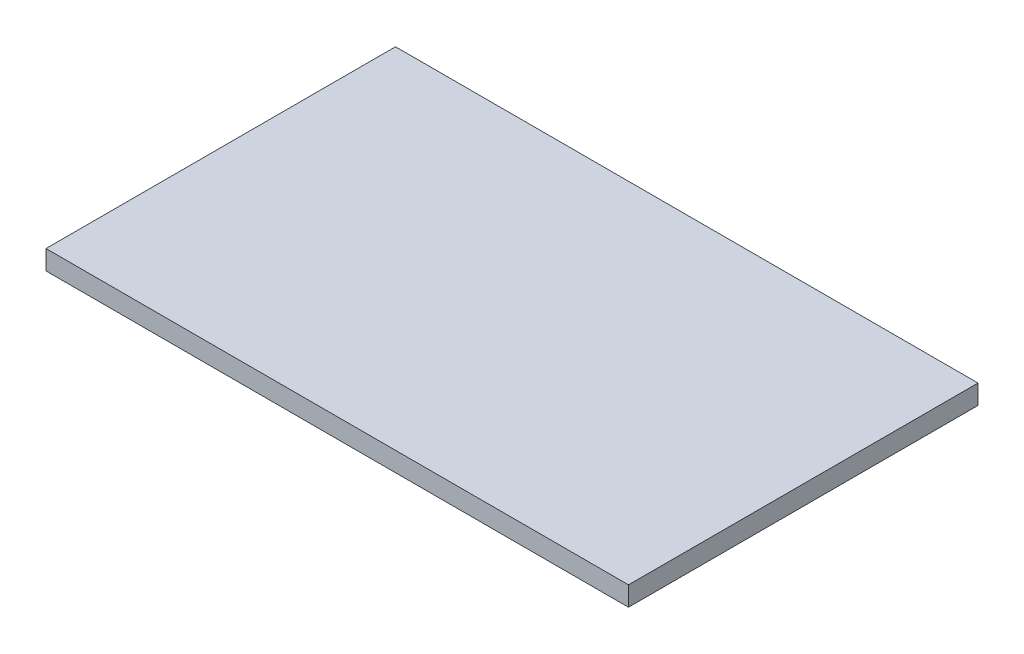
ISO-10303-21;
HEADER;
FILE_DESCRIPTION(('STEP AP214'),'2;1');
FILE_NAME('part.step','',(''),(''),'','','');
FILE_SCHEMA(('AUTOMOTIVE_DESIGN { 1 0 10303 214 1 1 1 1 }'));
ENDSEC;
DATA;
#1=APPLICATION_CONTEXT('core data for automotive mechanical design processes');
#2=APPLICATION_PROTOCOL_DEFINITION('international standard','automotive_design',2000,#1);
#3=PRODUCT_CONTEXT('',#1,'mechanical');
#4=PRODUCT('Part','Part','',(#3));
#5=PRODUCT_RELATED_PRODUCT_CATEGORY('part','',(#4));
#6=PRODUCT_DEFINITION_FORMATION('','',#4);
#7=PRODUCT_DEFINITION_CONTEXT('part definition',#1,'design');
#8=PRODUCT_DEFINITION('design','',#6,#7);
#9=PRODUCT_DEFINITION_SHAPE('','',#8);
#10=(LENGTH_UNIT() NAMED_UNIT(*) SI_UNIT(.MILLI.,.METRE.));
#11=(NAMED_UNIT(*) PLANE_ANGLE_UNIT() SI_UNIT($,.RADIAN.));
#12=(NAMED_UNIT(*) SI_UNIT($,.STERADIAN.) SOLID_ANGLE_UNIT());
#13=UNCERTAINTY_MEASURE_WITH_UNIT(LENGTH_MEASURE(1.E-05),#10,'distance_accuracy_value','');
#14=(GEOMETRIC_REPRESENTATION_CONTEXT(3) GLOBAL_UNCERTAINTY_ASSIGNED_CONTEXT((#13)) GLOBAL_UNIT_ASSIGNED_CONTEXT((#10,
#11,#12)) REPRESENTATION_CONTEXT('',''));
#15=CARTESIAN_POINT('',(0.,0.,0.));
#16=DIRECTION('',(0.,0.,1.));
#17=DIRECTION('',(1.,0.,0.));
#18=AXIS2_PLACEMENT_3D('',#15,#16,#17);
#19=CARTESIAN_POINT('',(0.,1.,0.));
#20=DIRECTION('',(1.,0.,0.));
#21=DIRECTION('',(0.,0.,-1.));
#22=AXIS2_PLACEMENT_3D('',#19,#20,#21);
#23=PLANE('',#22);
#24=DIRECTION('',(0.,0.,1.));
#25=VECTOR('',#24,1.);
#26=CARTESIAN_POINT('',(0.,0.,0.));
#27=LINE('',#26,#25);
#28=CARTESIAN_POINT('',(0.,0.,-18.));
#29=VERTEX_POINT('',#28);
#30=CARTESIAN_POINT('',(0.,0.,0.));
#31=VERTEX_POINT('',#30);
#32=EDGE_CURVE('E96',#29,#31,#27,.T.);
#33=ORIENTED_EDGE('',*,*,#32,.T.);
#34=DIRECTION('',(0.,-1.,0.));
#35=VECTOR('',#34,1.);
#36=CARTESIAN_POINT('',(0.,1.,0.));
#37=LINE('',#36,#35);
#38=CARTESIAN_POINT('',(0.,1.,0.));
#39=VERTEX_POINT('',#38);
#40=EDGE_CURVE('E11',#39,#31,#37,.T.);
#41=ORIENTED_EDGE('',*,*,#40,.F.);
#42=DIRECTION('',(0.,0.,1.));
#43=VECTOR('',#42,1.);
#44=CARTESIAN_POINT('',(0.,1.,0.));
#45=LINE('',#44,#43);
#46=CARTESIAN_POINT('',(0.,1.,-18.));
#47=VERTEX_POINT('',#46);
#48=EDGE_CURVE('E84',#47,#39,#45,.T.);
#49=ORIENTED_EDGE('',*,*,#48,.F.);
#50=DIRECTION('',(0.,-1.,0.));
#51=VECTOR('',#50,1.);
#52=CARTESIAN_POINT('',(0.,1.,-18.));
#53=LINE('',#52,#51);
#54=EDGE_CURVE('E92',#47,#29,#53,.T.);
#55=ORIENTED_EDGE('',*,*,#54,.T.);
#56=EDGE_LOOP('',(#33,#41,#49,#55));
#57=FACE_BOUND('',#56,.T.);
#58=ADVANCED_FACE('F33',(#57),#23,.F.);
#59=CARTESIAN_POINT('',(0.,1.,0.));
#60=DIRECTION('',(0.,0.,-1.));
#61=DIRECTION('',(-1.,0.,0.));
#62=AXIS2_PLACEMENT_3D('',#59,#60,#61);
#63=PLANE('',#62);
#64=DIRECTION('',(1.,0.,0.));
#65=VECTOR('',#64,1.);
#66=CARTESIAN_POINT('',(0.,0.,0.));
#67=LINE('',#66,#65);
#68=CARTESIAN_POINT('',(30.,0.,0.));
#69=VERTEX_POINT('',#68);
#70=EDGE_CURVE('E88',#31,#69,#67,.T.);
#71=ORIENTED_EDGE('',*,*,#70,.T.);
#72=DIRECTION('',(0.,-1.,0.));
#73=VECTOR('',#72,1.);
#74=CARTESIAN_POINT('',(30.,1.,0.));
#75=LINE('',#74,#73);
#76=CARTESIAN_POINT('',(30.,1.,0.));
#77=VERTEX_POINT('',#76);
#78=EDGE_CURVE('E41',#77,#69,#75,.T.);
#79=ORIENTED_EDGE('',*,*,#78,.F.);
#80=DIRECTION('',(1.,0.,0.));
#81=VECTOR('',#80,1.);
#82=CARTESIAN_POINT('',(0.,1.,0.));
#83=LINE('',#82,#81);
#84=EDGE_CURVE('E79',#39,#77,#83,.T.);
#85=ORIENTED_EDGE('',*,*,#84,.F.);
#86=ORIENTED_EDGE('',*,*,#40,.T.);
#87=EDGE_LOOP('',(#71,#79,#85,#86));
#88=FACE_BOUND('',#87,.T.);
#89=ADVANCED_FACE('F87',(#88),#63,.F.);
#90=CARTESIAN_POINT('',(30.,1.,0.));
#91=DIRECTION('',(-1.,0.,0.));
#92=DIRECTION('',(0.,0.,1.));
#93=AXIS2_PLACEMENT_3D('',#90,#91,#92);
#94=PLANE('',#93);
#95=DIRECTION('',(0.,0.,-1.));
#96=VECTOR('',#95,1.);
#97=CARTESIAN_POINT('',(30.,0.,0.));
#98=LINE('',#97,#96);
#99=CARTESIAN_POINT('',(30.,0.,-18.));
#100=VERTEX_POINT('',#99);
#101=EDGE_CURVE('E66',#69,#100,#98,.T.);
#102=ORIENTED_EDGE('',*,*,#101,.T.);
#103=DIRECTION('',(0.,-1.,0.));
#104=VECTOR('',#103,1.);
#105=CARTESIAN_POINT('',(30.,1.,-18.));
#106=LINE('',#105,#104);
#107=CARTESIAN_POINT('',(30.,1.,-18.));
#108=VERTEX_POINT('',#107);
#109=EDGE_CURVE('E89',#108,#100,#106,.T.);
#110=ORIENTED_EDGE('',*,*,#109,.F.);
#111=DIRECTION('',(0.,0.,-1.));
#112=VECTOR('',#111,1.);
#113=CARTESIAN_POINT('',(30.,1.,0.));
#114=LINE('',#113,#112);
#115=EDGE_CURVE('E82',#77,#108,#114,.T.);
#116=ORIENTED_EDGE('',*,*,#115,.F.);
#117=ORIENTED_EDGE('',*,*,#78,.T.);
#118=EDGE_LOOP('',(#102,#110,#116,#117));
#119=FACE_BOUND('',#118,.T.);
#120=ADVANCED_FACE('F90',(#119),#94,.F.);
#121=CARTESIAN_POINT('',(0.,1.,-18.));
#122=DIRECTION('',(0.,0.,1.));
#123=DIRECTION('',(1.,0.,0.));
#124=AXIS2_PLACEMENT_3D('',#121,#122,#123);
#125=PLANE('',#124);
#126=DIRECTION('',(-1.,0.,0.));
#127=VECTOR('',#126,1.);
#128=CARTESIAN_POINT('',(0.,0.,-18.));
#129=LINE('',#128,#127);
#130=EDGE_CURVE('E72',#100,#29,#129,.T.);
#131=ORIENTED_EDGE('',*,*,#130,.T.);
#132=ORIENTED_EDGE('',*,*,#54,.F.);
#133=DIRECTION('',(-1.,0.,0.));
#134=VECTOR('',#133,1.);
#135=CARTESIAN_POINT('',(0.,1.,-18.));
#136=LINE('',#135,#134);
#137=EDGE_CURVE('E49',#108,#47,#136,.T.);
#138=ORIENTED_EDGE('',*,*,#137,.F.);
#139=ORIENTED_EDGE('',*,*,#109,.T.);
#140=EDGE_LOOP('',(#131,#132,#138,#139));
#141=FACE_BOUND('',#140,.T.);
#142=ADVANCED_FACE('F103',(#141),#125,.F.);
#143=CARTESIAN_POINT('',(0.,1.,0.));
#144=DIRECTION('',(0.,-1.,0.));
#145=DIRECTION('',(0.,0.,-1.));
#146=AXIS2_PLACEMENT_3D('',#143,#144,#145);
#147=PLANE('',#146);
#148=ORIENTED_EDGE('',*,*,#48,.T.);
#149=ORIENTED_EDGE('',*,*,#84,.T.);
#150=ORIENTED_EDGE('',*,*,#115,.T.);
#151=ORIENTED_EDGE('',*,*,#137,.T.);
#152=EDGE_LOOP('',(#148,#149,#150,#151));
#153=FACE_BOUND('',#152,.T.);
#154=ADVANCED_FACE('F80',(#153),#147,.F.);
#155=CARTESIAN_POINT('',(0.,0.,0.));
#156=DIRECTION('',(0.,-1.,0.));
#157=DIRECTION('',(0.,0.,-1.));
#158=AXIS2_PLACEMENT_3D('',#155,#156,#157);
#159=PLANE('',#158);
#160=ORIENTED_EDGE('',*,*,#32,.F.);
#161=ORIENTED_EDGE('',*,*,#130,.F.);
#162=ORIENTED_EDGE('',*,*,#101,.F.);
#163=ORIENTED_EDGE('',*,*,#70,.F.);
#164=EDGE_LOOP('',(#160,#161,#162,#163));
#165=FACE_BOUND('',#164,.T.);
#166=ADVANCED_FACE('F106',(#165),#159,.T.);
#167=CLOSED_SHELL('',(#58,#89,#120,#142,#154,#166));
#168=MANIFOLD_SOLID_BREP('B2',#167);
#169=ADVANCED_BREP_SHAPE_REPRESENTATION('',(#18,#168),#14);
#170=SHAPE_DEFINITION_REPRESENTATION(#9,#169);
ENDSEC;
END-ISO-10303-21;
